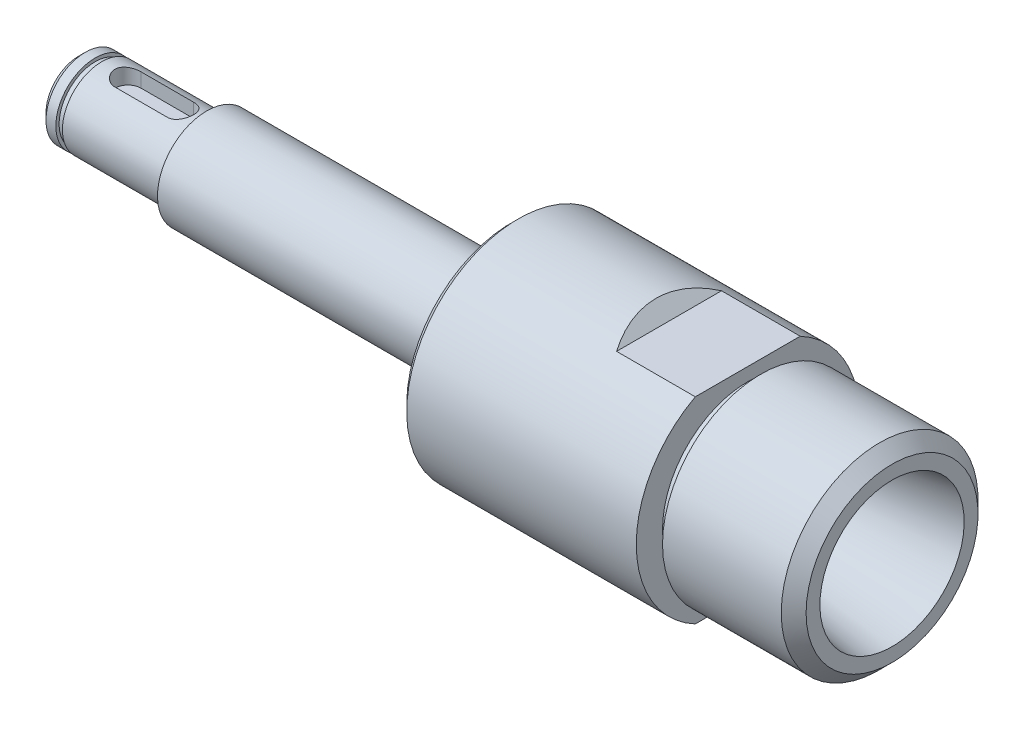
ISO-10303-21;
HEADER;
FILE_DESCRIPTION(('STEP AP214'),'2;1');
FILE_NAME('part.step','',(''),(''),'','','');
FILE_SCHEMA(('AUTOMOTIVE_DESIGN { 1 0 10303 214 1 1 1 1 }'));
ENDSEC;
DATA;
#1=APPLICATION_CONTEXT('core data for automotive mechanical design processes');
#2=APPLICATION_PROTOCOL_DEFINITION('international standard','automotive_design',2000,#1);
#3=PRODUCT_CONTEXT('',#1,'mechanical');
#4=PRODUCT('Part','Part','',(#3));
#5=PRODUCT_RELATED_PRODUCT_CATEGORY('part','',(#4));
#6=PRODUCT_DEFINITION_FORMATION('','',#4);
#7=PRODUCT_DEFINITION_CONTEXT('part definition',#1,'design');
#8=PRODUCT_DEFINITION('design','',#6,#7);
#9=PRODUCT_DEFINITION_SHAPE('','',#8);
#10=(LENGTH_UNIT() NAMED_UNIT(*) SI_UNIT(.MILLI.,.METRE.));
#11=(NAMED_UNIT(*) PLANE_ANGLE_UNIT() SI_UNIT($,.RADIAN.));
#12=(NAMED_UNIT(*) SI_UNIT($,.STERADIAN.) SOLID_ANGLE_UNIT());
#13=UNCERTAINTY_MEASURE_WITH_UNIT(LENGTH_MEASURE(1.E-05),#10,'distance_accuracy_value','');
#14=(GEOMETRIC_REPRESENTATION_CONTEXT(3) GLOBAL_UNCERTAINTY_ASSIGNED_CONTEXT((#13)) GLOBAL_UNIT_ASSIGNED_CONTEXT((#10,
#11,#12)) REPRESENTATION_CONTEXT('',''));
#15=CARTESIAN_POINT('',(0.,0.,0.));
#16=DIRECTION('',(0.,0.,1.));
#17=DIRECTION('',(1.,0.,0.));
#18=AXIS2_PLACEMENT_3D('',#15,#16,#17);
#19=CARTESIAN_POINT('',(124.,0.,0.));
#20=DIRECTION('',(1.,0.,0.));
#21=DIRECTION('',(0.,1.,0.));
#22=AXIS2_PLACEMENT_3D('',#19,#20,#21);
#23=CYLINDRICAL_SURFACE('',#22,5.99999999999998);
#24=CARTESIAN_POINT('',(3.5,0.,0.));
#25=DIRECTION('',(1.,0.,0.));
#26=DIRECTION('',(0.,1.,0.));
#27=AXIS2_PLACEMENT_3D('',#24,#25,#26);
#28=CIRCLE('',#27,5.99999999999998);
#29=CARTESIAN_POINT('',(3.5,5.99999999999998,0.));
#30=VERTEX_POINT('',#29);
#31=EDGE_CURVE('E222',#30,#30,#28,.T.);
#32=ORIENTED_EDGE('',*,*,#31,.T.);
#33=EDGE_LOOP('',(#32));
#34=FACE_BOUND('',#33,.T.);
#35=CARTESIAN_POINT('',(18.5,0.,0.));
#36=DIRECTION('',(1.,0.,0.));
#37=DIRECTION('',(0.,1.,0.));
#38=AXIS2_PLACEMENT_3D('',#35,#36,#37);
#39=CIRCLE('',#38,5.99999999999998);
#40=CARTESIAN_POINT('',(18.5,5.99999999999998,0.));
#41=VERTEX_POINT('',#40);
#42=EDGE_CURVE('E219',#41,#41,#39,.T.);
#43=ORIENTED_EDGE('',*,*,#42,.F.);
#44=EDGE_LOOP('',(#43));
#45=FACE_BOUND('',#44,.T.);
#46=DIRECTION('',(1.,0.,0.));
#47=VECTOR('',#46,1.);
#48=CARTESIAN_POINT('',(124.,5.65685424949236,-2.00000000000001));
#49=LINE('',#48,#47);
#50=CARTESIAN_POINT('',(7.5,5.65685424949236,-2.));
#51=VERTEX_POINT('',#50);
#52=CARTESIAN_POINT('',(15.5,5.65685424949236,-2.));
#53=VERTEX_POINT('',#52);
#54=EDGE_CURVE('E279',#51,#53,#49,.T.);
#55=ORIENTED_EDGE('',*,*,#54,.T.);
#56=CARTESIAN_POINT('',(15.5,5.65685424949236,-2.));
#57=CARTESIAN_POINT('',(15.5545809936022,5.65684884188676,-2.0000014949184));
#58=CARTESIAN_POINT('',(15.6091341243787,5.65764519886488,-1.99776424917478));
#59=CARTESIAN_POINT('',(15.7178171681098,5.6607865457844,-1.9888512140728));
#60=CARTESIAN_POINT('',(15.7719471913194,5.66313111768242,-1.98217662286705));
#61=CARTESIAN_POINT('',(15.9327842863903,5.672381844493,-1.95562135046158));
#62=CARTESIAN_POINT('',(16.038361692541,5.68150584999028,-1.92920846605623));
#63=CARTESIAN_POINT('',(16.2432503848876,5.70456149397716,-1.85991682366086));
#64=CARTESIAN_POINT('',(16.3425650937458,5.71849047905857,-1.81704715197507));
#65=CARTESIAN_POINT('',(16.5326796680109,5.74957574438919,-1.71614645792974));
#66=CARTESIAN_POINT('',(16.6234742581347,5.76673400456215,-1.65810612564547));
#67=CARTESIAN_POINT('',(16.7974404626491,5.80308960804093,-1.52610278704602));
#68=CARTESIAN_POINT('',(16.8802297609252,5.82233755536616,-1.45164996064407));
#69=CARTESIAN_POINT('',(17.0324120355834,5.86027697385954,-1.28997688598297));
#70=CARTESIAN_POINT('',(17.1018026265119,5.87896834543704,-1.20275436910907));
#71=CARTESIAN_POINT('',(17.2269590376084,5.91427765988453,-1.01520729191253));
#72=CARTESIAN_POINT('',(17.2823219688045,5.93082875123706,-0.914600178716994));
#73=CARTESIAN_POINT('',(17.3751845033745,5.95939217209315,-0.704858499931718));
#74=CARTESIAN_POINT('',(17.4126895636409,5.97140588786618,-0.59572655118684));
#75=CARTESIAN_POINT('',(17.4674714521827,5.98918142285844,-0.376058690956073));
#76=CARTESIAN_POINT('',(17.4854065451074,5.99514617977145,-0.265703668920224));
#77=CARTESIAN_POINT('',(17.5026325970512,6.00087216807632,-0.0433979389113463));
#78=CARTESIAN_POINT('',(17.5019279985395,6.00063487762603,0.0685523824907843));
#79=CARTESIAN_POINT('',(17.4823114337867,5.9941207727053,0.286207690558783));
#80=CARTESIAN_POINT('',(17.4641147240811,5.98808121982526,0.391985405251072));
#81=CARTESIAN_POINT('',(17.4112136026518,5.97093921001645,0.598888128753311));
#82=CARTESIAN_POINT('',(17.3765082755875,5.95983647235461,0.700012879232928));
#83=CARTESIAN_POINT('',(17.2911572607987,5.93351336542607,0.896305246061924));
#84=CARTESIAN_POINT('',(17.2403079097553,5.91824075676624,0.991377011307984));
#85=CARTESIAN_POINT('',(17.1242800972186,5.88516775360086,1.17184917819498));
#86=CARTESIAN_POINT('',(17.059097737907,5.86736667195185,1.25724693942937));
#87=CARTESIAN_POINT('',(16.9126579000063,5.83012543885477,1.42019467942242));
#88=CARTESIAN_POINT('',(16.8307889127806,5.81064757359827,1.4971872232254));
#89=CARTESIAN_POINT('',(16.6551170205677,5.77294980945701,1.63654404964077));
#90=CARTESIAN_POINT('',(16.5613102751935,5.75473031831505,1.69890360636763));
#91=CARTESIAN_POINT('',(16.3626396432934,5.72140062752633,1.80800665118557));
#92=CARTESIAN_POINT('',(16.2576329701341,5.70634029896467,1.85450601901537));
#93=CARTESIAN_POINT('',(16.0407060448201,5.68162194124076,1.92892046140223));
#94=CARTESIAN_POINT('',(15.9287970132557,5.67195538817984,1.95686487211071));
#95=CARTESIAN_POINT('',(15.763162726504,5.66273084189438,1.98331631256166));
#96=CARTESIAN_POINT('',(15.7107172202915,5.66053335389202,1.98957012251023));
#97=CARTESIAN_POINT('',(15.6055238432004,5.65759407142796,1.99790923214239));
#98=CARTESIAN_POINT('',(15.5527764509112,5.65685039859054,1.99999991078996));
#99=CARTESIAN_POINT('',(15.5,5.65685424949236,2.));
#100=B_SPLINE_CURVE_WITH_KNOTS('',3,(#56,#57,#58,#59,#60,#61,#62,#63,#64,#65,#66,#67,#68,#69,
#70,#71,#72,#73,#74,#75,#76,#77,#78,#79,#80,#81,#82,#83,#84,#85,#86,#87,#88,#89,#90,#91,#92,#93,
#94,#95,#96,#97,#98,#99),.UNSPECIFIED.,.F.,.F.,(4,2,2,2,2,2,2,2,2,2,2,2,2,2,2,2,2,2,2,2,2,4),
(0.,0.163636969470864,0.327229772338923,0.653162396790745,0.978915321932474,1.30486862627062,
1.64233009925355,1.97985159727495,2.32618265866202,2.67240782242255,3.00658941454806,
3.34069136061284,3.6616883693147,3.98270317816496,4.30794037651935,4.63326613177537,
4.973881081161,5.31460588498485,5.6603605985608,6.00556734973678,6.16399790665503,
6.32222363058113),.UNSPECIFIED.);
#101=CARTESIAN_POINT('',(15.5,5.65685424949237,2.));
#102=VERTEX_POINT('',#101);
#103=EDGE_CURVE('E304',#53,#102,#100,.T.);
#104=ORIENTED_EDGE('',*,*,#103,.T.);
#105=DIRECTION('',(1.,0.,0.));
#106=VECTOR('',#105,1.);
#107=CARTESIAN_POINT('',(124.,5.65685424949237,1.99999999999998));
#108=LINE('',#107,#106);
#109=CARTESIAN_POINT('',(7.50000000000001,5.65685424949237,1.99999999999998));
#110=VERTEX_POINT('',#109);
#111=EDGE_CURVE('E267',#102,#110,#108,.F.);
#112=ORIENTED_EDGE('',*,*,#111,.T.);
#113=CARTESIAN_POINT('',(7.5,5.65685424949236,2.));
#114=CARTESIAN_POINT('',(7.44541900639777,5.65684884188676,2.0000014949184));
#115=CARTESIAN_POINT('',(7.39086587562135,5.65764519886489,1.99776424917478));
#116=CARTESIAN_POINT('',(7.28218283189021,5.6607865457844,1.9888512140728));
#117=CARTESIAN_POINT('',(7.22805280868062,5.66313111768242,1.98217662286705));
#118=CARTESIAN_POINT('',(7.06721571360973,5.672381844493,1.95562135046158));
#119=CARTESIAN_POINT('',(6.96163830745905,5.68150584999028,1.92920846605623));
#120=CARTESIAN_POINT('',(6.75674961511245,5.70456149397716,1.85991682366086));
#121=CARTESIAN_POINT('',(6.65743490625416,5.71849047905857,1.81704715197507));
#122=CARTESIAN_POINT('',(6.46732033198908,5.74957574438919,1.71614645792974));
#123=CARTESIAN_POINT('',(6.37652574186531,5.76673400456215,1.65810612564547));
#124=CARTESIAN_POINT('',(6.20255953735094,5.80308960804093,1.52610278704603));
#125=CARTESIAN_POINT('',(6.11977023907478,5.82233755536616,1.45164996064407));
#126=CARTESIAN_POINT('',(5.96758796441661,5.86027697385954,1.28997688598296));
#127=CARTESIAN_POINT('',(5.89819737348812,5.87896834543704,1.20275436910907));
#128=CARTESIAN_POINT('',(5.77304096239161,5.91427765988453,1.01520729191253));
#129=CARTESIAN_POINT('',(5.71767803119549,5.93082875123706,0.914600178716992));
#130=CARTESIAN_POINT('',(5.62481549662547,5.95939217209315,0.704858499931717));
#131=CARTESIAN_POINT('',(5.58731043635913,5.97140588786617,0.595726551186839));
#132=CARTESIAN_POINT('',(5.53252854781726,5.98918142285844,0.376058690956073));
#133=CARTESIAN_POINT('',(5.51459345489264,5.99514617977145,0.265703668920223));
#134=CARTESIAN_POINT('',(5.49736740294879,6.00087216807632,0.043397938911345));
#135=CARTESIAN_POINT('',(5.49807200146051,6.00063487762603,-0.068552382490786));
#136=CARTESIAN_POINT('',(5.51768856621331,5.9941207727053,-0.286207690558786));
#137=CARTESIAN_POINT('',(5.53588527591893,5.98808121982526,-0.391985405251074));
#138=CARTESIAN_POINT('',(5.58878639734825,5.97093921001646,-0.598888128753314));
#139=CARTESIAN_POINT('',(5.62349172441251,5.95983647235461,-0.70001287923293));
#140=CARTESIAN_POINT('',(5.70884273920127,5.93351336542607,-0.896305246061926));
#141=CARTESIAN_POINT('',(5.75969209024468,5.91824075676623,-0.991377011307985));
#142=CARTESIAN_POINT('',(5.8757199027814,5.88516775360086,-1.17184917819498));
#143=CARTESIAN_POINT('',(5.94090226209303,5.86736667195185,-1.25724693942937));
#144=CARTESIAN_POINT('',(6.08734209999369,5.83012543885477,-1.42019467942243));
#145=CARTESIAN_POINT('',(6.16921108721942,5.81064757359827,-1.4971872232254));
#146=CARTESIAN_POINT('',(6.34488297943233,5.77294980945701,-1.63654404964077));
#147=CARTESIAN_POINT('',(6.43868972480649,5.75473031831505,-1.69890360636763));
#148=CARTESIAN_POINT('',(6.63736035670657,5.72140062752633,-1.80800665118557));
#149=CARTESIAN_POINT('',(6.74236702986589,5.70634029896467,-1.85450601901537));
#150=CARTESIAN_POINT('',(6.95929395517991,5.68162194124076,-1.92892046140223));
#151=CARTESIAN_POINT('',(7.07120298674431,5.67195538817984,-1.95686487211071));
#152=CARTESIAN_POINT('',(7.23683727349597,5.66273084189438,-1.98331631256166));
#153=CARTESIAN_POINT('',(7.28928277970846,5.66053335389202,-1.98957012251023));
#154=CARTESIAN_POINT('',(7.39447615679963,5.65759407142796,-1.9979092321424));
#155=CARTESIAN_POINT('',(7.44722354908881,5.65685039859054,-1.99999991078996));
#156=CARTESIAN_POINT('',(7.50000000000001,5.65685424949236,-2.));
#157=B_SPLINE_CURVE_WITH_KNOTS('',3,(#113,#114,#115,#116,#117,#118,#119,#120,#121,#122,#123,
#124,#125,#126,#127,#128,#129,#130,#131,#132,#133,#134,#135,#136,#137,#138,#139,#140,#141,#142,
#143,#144,#145,#146,#147,#148,#149,#150,#151,#152,#153,#154,#155,#156),.UNSPECIFIED.,.F.,.F.,(4,
2,2,2,2,2,2,2,2,2,2,2,2,2,2,2,2,2,2,2,2,4),(0.,0.163636969470865,0.327229772338923,
0.653162396790746,0.978915321932474,1.30486862627062,1.64233009925355,1.97985159727495,
2.32618265866203,2.67240782242255,3.00658941454806,3.34069136061285,3.6616883693147,
3.98270317816496,4.30794037651936,4.63326613177537,4.97388108116101,5.31460588498485,
5.6603605985608,6.00556734973678,6.16399790665503,6.32222363058113),.UNSPECIFIED.);
#158=EDGE_CURVE('E270',#110,#51,#157,.T.);
#159=ORIENTED_EDGE('',*,*,#158,.T.);
#160=EDGE_LOOP('',(#55,#104,#112,#159));
#161=FACE_BOUND('',#160,.T.);
#162=ADVANCED_FACE('F47',(#34,#45,#161),#23,.T.);
#163=CARTESIAN_POINT('',(124.,0.,0.));
#164=DIRECTION('',(1.,0.,0.));
#165=DIRECTION('',(0.,1.,0.));
#166=AXIS2_PLACEMENT_3D('',#163,#164,#165);
#167=CYLINDRICAL_SURFACE('',#166,17.);
#168=CARTESIAN_POINT('',(67.,0.,0.));
#169=DIRECTION('',(-1.,0.,0.));
#170=DIRECTION('',(0.,-1.,0.));
#171=AXIS2_PLACEMENT_3D('',#168,#169,#170);
#172=CIRCLE('',#171,17.);
#173=CARTESIAN_POINT('',(67.,-17.,0.));
#174=VERTEX_POINT('',#173);
#175=EDGE_CURVE('E234',#174,#174,#172,.F.);
#176=ORIENTED_EDGE('',*,*,#175,.T.);
#177=EDGE_LOOP('',(#176));
#178=FACE_BOUND('',#177,.T.);
#179=CARTESIAN_POINT('',(102.,0.,0.));
#180=DIRECTION('',(1.,0.,0.));
#181=DIRECTION('',(0.,1.,0.));
#182=AXIS2_PLACEMENT_3D('',#179,#180,#181);
#183=CIRCLE('',#182,17.);
#184=CARTESIAN_POINT('',(102.,15.,-7.99999999999999));
#185=VERTEX_POINT('',#184);
#186=CARTESIAN_POINT('',(102.,-15.,-7.99999999999998));
#187=VERTEX_POINT('',#186);
#188=EDGE_CURVE('E204',#185,#187,#183,.F.);
#189=ORIENTED_EDGE('',*,*,#188,.T.);
#190=DIRECTION('',(1.,0.,0.));
#191=VECTOR('',#190,1.);
#192=CARTESIAN_POINT('',(124.,-15.,-7.99999999999998));
#193=LINE('',#192,#191);
#194=CARTESIAN_POINT('',(90.,-15.,-7.99999999999998));
#195=VERTEX_POINT('',#194);
#196=EDGE_CURVE('E181',#187,#195,#193,.F.);
#197=ORIENTED_EDGE('',*,*,#196,.T.);
#198=CARTESIAN_POINT('',(105.,0.,0.));
#199=DIRECTION('',(0.70710678118654,-0.707106781186555,0.));
#200=DIRECTION('',(0.707106781186555,0.70710678118654,0.));
#201=AXIS2_PLACEMENT_3D('',#198,#199,#200);
#202=ELLIPSE('',#201,24.0416305603429,17.);
#203=CARTESIAN_POINT('',(88.,-17.,0.));
#204=VERTEX_POINT('',#203);
#205=EDGE_CURVE('E260',#195,#204,#202,.F.);
#206=ORIENTED_EDGE('',*,*,#205,.T.);
#207=CARTESIAN_POINT('',(105.,0.,0.));
#208=DIRECTION('',(0.70710678118654,-0.707106781186555,0.));
#209=DIRECTION('',(0.707106781186555,0.70710678118654,0.));
#210=AXIS2_PLACEMENT_3D('',#207,#208,#209);
#211=ELLIPSE('',#210,24.0416305603429,17.);
#212=CARTESIAN_POINT('',(90.,-15.,7.99999999999998));
#213=VERTEX_POINT('',#212);
#214=EDGE_CURVE('E262',#204,#213,#211,.F.);
#215=ORIENTED_EDGE('',*,*,#214,.T.);
#216=DIRECTION('',(1.,0.,0.));
#217=VECTOR('',#216,1.);
#218=CARTESIAN_POINT('',(124.,-15.,7.99999999999998));
#219=LINE('',#218,#217);
#220=CARTESIAN_POINT('',(102.,-15.,7.99999999999998));
#221=VERTEX_POINT('',#220);
#222=EDGE_CURVE('E179',#213,#221,#219,.T.);
#223=ORIENTED_EDGE('',*,*,#222,.T.);
#224=CARTESIAN_POINT('',(102.,15.,7.99999999999999));
#225=VERTEX_POINT('',#224);
#226=EDGE_CURVE('E197',#221,#225,#183,.F.);
#227=ORIENTED_EDGE('',*,*,#226,.T.);
#228=DIRECTION('',(1.,0.,0.));
#229=VECTOR('',#228,1.);
#230=CARTESIAN_POINT('',(124.,15.,7.99999999999999));
#231=LINE('',#230,#229);
#232=CARTESIAN_POINT('',(90.,15.,7.99999999999999));
#233=VERTEX_POINT('',#232);
#234=EDGE_CURVE('E177',#225,#233,#231,.F.);
#235=ORIENTED_EDGE('',*,*,#234,.T.);
#236=CARTESIAN_POINT('',(105.,0.,0.));
#237=DIRECTION('',(0.707106781186542,0.707106781186553,0.));
#238=DIRECTION('',(0.707106781186553,-0.707106781186542,0.));
#239=AXIS2_PLACEMENT_3D('',#236,#237,#238);
#240=ELLIPSE('',#239,24.0416305603428,17.);
#241=CARTESIAN_POINT('',(88.,17.,0.));
#242=VERTEX_POINT('',#241);
#243=EDGE_CURVE('E71',#233,#242,#240,.F.);
#244=ORIENTED_EDGE('',*,*,#243,.T.);
#245=CARTESIAN_POINT('',(105.,0.,0.));
#246=DIRECTION('',(0.707106781186542,0.707106781186553,0.));
#247=DIRECTION('',(0.707106781186553,-0.707106781186542,0.));
#248=AXIS2_PLACEMENT_3D('',#245,#246,#247);
#249=ELLIPSE('',#248,24.0416305603428,17.);
#250=CARTESIAN_POINT('',(90.,15.,-7.99999999999999));
#251=VERTEX_POINT('',#250);
#252=EDGE_CURVE('E265',#242,#251,#249,.F.);
#253=ORIENTED_EDGE('',*,*,#252,.T.);
#254=DIRECTION('',(1.,0.,0.));
#255=VECTOR('',#254,1.);
#256=CARTESIAN_POINT('',(124.,15.,-7.99999999999999));
#257=LINE('',#256,#255);
#258=EDGE_CURVE('E175',#251,#185,#257,.T.);
#259=ORIENTED_EDGE('',*,*,#258,.T.);
#260=EDGE_LOOP('',(#189,#197,#206,#215,#223,#227,#235,#244,#253,#259));
#261=FACE_BOUND('',#260,.T.);
#262=ADVANCED_FACE('F322',(#178,#261),#167,.T.);
#263=CARTESIAN_POINT('',(102.,0.,0.));
#264=DIRECTION('',(1.,0.,0.));
#265=DIRECTION('',(0.,1.,0.));
#266=AXIS2_PLACEMENT_3D('',#263,#264,#265);
#267=PLANE('',#266);
#268=CARTESIAN_POINT('',(102.,0.,0.));
#269=DIRECTION('',(1.,0.,0.));
#270=DIRECTION('',(0.,1.,0.));
#271=AXIS2_PLACEMENT_3D('',#268,#269,#270);
#272=CIRCLE('',#271,13.);
#273=CARTESIAN_POINT('',(102.,13.,0.));
#274=VERTEX_POINT('',#273);
#275=EDGE_CURVE('E193',#274,#274,#272,.T.);
#276=ORIENTED_EDGE('',*,*,#275,.F.);
#277=EDGE_LOOP('',(#276));
#278=FACE_BOUND('',#277,.T.);
#279=ORIENTED_EDGE('',*,*,#226,.F.);
#280=DIRECTION('',(0.,0.,-1.));
#281=VECTOR('',#280,1.);
#282=CARTESIAN_POINT('',(102.,-15.,0.));
#283=LINE('',#282,#281);
#284=EDGE_CURVE('E251',#221,#187,#283,.T.);
#285=ORIENTED_EDGE('',*,*,#284,.T.);
#286=ORIENTED_EDGE('',*,*,#188,.F.);
#287=DIRECTION('',(0.,0.,1.));
#288=VECTOR('',#287,1.);
#289=CARTESIAN_POINT('',(102.,15.,0.));
#290=LINE('',#289,#288);
#291=EDGE_CURVE('E246',#185,#225,#290,.T.);
#292=ORIENTED_EDGE('',*,*,#291,.T.);
#293=EDGE_LOOP('',(#279,#285,#286,#292));
#294=FACE_BOUND('',#293,.T.);
#295=ADVANCED_FACE('F328',(#278,#294),#267,.T.);
#296=CARTESIAN_POINT('',(0.,0.,0.));
#297=DIRECTION('',(-1.,0.,0.));
#298=DIRECTION('',(0.,-1.,0.));
#299=AXIS2_PLACEMENT_3D('',#296,#297,#298);
#300=PLANE('',#299);
#301=CARTESIAN_POINT('',(0.,0.,0.));
#302=DIRECTION('',(-1.,0.,0.));
#303=DIRECTION('',(0.,-1.,0.));
#304=AXIS2_PLACEMENT_3D('',#301,#302,#303);
#305=CIRCLE('',#304,5.);
#306=CARTESIAN_POINT('',(0.,-5.,0.));
#307=VERTEX_POINT('',#306);
#308=EDGE_CURVE('E243',#307,#307,#305,.T.);
#309=ORIENTED_EDGE('',*,*,#308,.T.);
#310=EDGE_LOOP('',(#309));
#311=FACE_BOUND('',#310,.T.);
#312=ADVANCED_FACE('F417',(#311),#300,.T.);
#313=CARTESIAN_POINT('',(124.,0.,0.));
#314=DIRECTION('',(1.,0.,0.));
#315=DIRECTION('',(0.,1.,0.));
#316=AXIS2_PLACEMENT_3D('',#313,#314,#315);
#317=CYLINDRICAL_SURFACE('',#316,5.99999999999998);
#318=CARTESIAN_POINT('',(0.999999999999987,0.,0.));
#319=DIRECTION('',(-1.,0.,0.));
#320=DIRECTION('',(0.,-1.,0.));
#321=AXIS2_PLACEMENT_3D('',#318,#319,#320);
#322=CIRCLE('',#321,5.99999999999998);
#323=CARTESIAN_POINT('',(0.999999999999987,-5.99999999999998,0.));
#324=VERTEX_POINT('',#323);
#325=EDGE_CURVE('E240',#324,#324,#322,.F.);
#326=ORIENTED_EDGE('',*,*,#325,.T.);
#327=EDGE_LOOP('',(#326));
#328=FACE_BOUND('',#327,.T.);
#329=CARTESIAN_POINT('',(2.5,0.,0.));
#330=DIRECTION('',(1.,0.,0.));
#331=DIRECTION('',(0.,1.,0.));
#332=AXIS2_PLACEMENT_3D('',#329,#330,#331);
#333=CIRCLE('',#332,5.99999999999998);
#334=CARTESIAN_POINT('',(2.5,5.99999999999998,0.));
#335=VERTEX_POINT('',#334);
#336=EDGE_CURVE('E231',#335,#335,#333,.T.);
#337=ORIENTED_EDGE('',*,*,#336,.F.);
#338=EDGE_LOOP('',(#337));
#339=FACE_BOUND('',#338,.T.);
#340=ADVANCED_FACE('F476',(#328,#339),#317,.T.);
#341=CARTESIAN_POINT('',(2.50000000000001,5.99999999999998,0.));
#342=DIRECTION('',(1.,0.,0.));
#343=DIRECTION('',(0.,1.,0.));
#344=AXIS2_PLACEMENT_3D('',#341,#342,#343);
#345=PLANE('',#344);
#346=ORIENTED_EDGE('',*,*,#336,.T.);
#347=EDGE_LOOP('',(#346));
#348=FACE_BOUND('',#347,.T.);
#349=CARTESIAN_POINT('',(2.5,0.,0.));
#350=DIRECTION('',(1.,0.,0.));
#351=DIRECTION('',(0.,1.,0.));
#352=AXIS2_PLACEMENT_3D('',#349,#350,#351);
#353=CIRCLE('',#352,5.49999999999998);
#354=CARTESIAN_POINT('',(2.5,5.49999999999998,0.));
#355=VERTEX_POINT('',#354);
#356=EDGE_CURVE('E228',#355,#355,#353,.T.);
#357=ORIENTED_EDGE('',*,*,#356,.F.);
#358=EDGE_LOOP('',(#357));
#359=FACE_BOUND('',#358,.T.);
#360=ADVANCED_FACE('F469',(#348,#359),#345,.T.);
#361=CARTESIAN_POINT('',(124.,0.,0.));
#362=DIRECTION('',(1.,0.,0.));
#363=DIRECTION('',(0.,1.,0.));
#364=AXIS2_PLACEMENT_3D('',#361,#362,#363);
#365=CYLINDRICAL_SURFACE('',#364,5.49999999999998);
#366=ORIENTED_EDGE('',*,*,#356,.T.);
#367=EDGE_LOOP('',(#366));
#368=FACE_BOUND('',#367,.T.);
#369=CARTESIAN_POINT('',(3.5,0.,0.));
#370=DIRECTION('',(1.,0.,0.));
#371=DIRECTION('',(0.,1.,0.));
#372=AXIS2_PLACEMENT_3D('',#369,#370,#371);
#373=CIRCLE('',#372,5.49999999999998);
#374=CARTESIAN_POINT('',(3.5,5.49999999999998,0.));
#375=VERTEX_POINT('',#374);
#376=EDGE_CURVE('E225',#375,#375,#373,.T.);
#377=ORIENTED_EDGE('',*,*,#376,.F.);
#378=EDGE_LOOP('',(#377));
#379=FACE_BOUND('',#378,.T.);
#380=ADVANCED_FACE('F451',(#368,#379),#365,.T.);
#381=CARTESIAN_POINT('',(3.50000000000001,5.49999999999998,0.));
#382=DIRECTION('',(-1.,0.,0.));
#383=DIRECTION('',(0.,-1.,0.));
#384=AXIS2_PLACEMENT_3D('',#381,#382,#383);
#385=PLANE('',#384);
#386=ORIENTED_EDGE('',*,*,#376,.T.);
#387=EDGE_LOOP('',(#386));
#388=FACE_BOUND('',#387,.T.);
#389=ORIENTED_EDGE('',*,*,#31,.F.);
#390=EDGE_LOOP('',(#389));
#391=FACE_BOUND('',#390,.T.);
#392=ADVANCED_FACE('F446',(#388,#391),#385,.T.);
#393=CARTESIAN_POINT('',(18.5,5.99999999999998,0.));
#394=DIRECTION('',(1.,0.,0.));
#395=DIRECTION('',(0.,1.,0.));
#396=AXIS2_PLACEMENT_3D('',#393,#394,#395);
#397=PLANE('',#396);
#398=ORIENTED_EDGE('',*,*,#42,.T.);
#399=EDGE_LOOP('',(#398));
#400=FACE_BOUND('',#399,.T.);
#401=CARTESIAN_POINT('',(18.5,0.,0.));
#402=DIRECTION('',(1.,0.,0.));
#403=DIRECTION('',(0.,1.,0.));
#404=AXIS2_PLACEMENT_3D('',#401,#402,#403);
#405=CIRCLE('',#404,5.49999999999998);
#406=CARTESIAN_POINT('',(18.5,5.49999999999998,0.));
#407=VERTEX_POINT('',#406);
#408=EDGE_CURVE('E216',#407,#407,#405,.T.);
#409=ORIENTED_EDGE('',*,*,#408,.F.);
#410=EDGE_LOOP('',(#409));
#411=FACE_BOUND('',#410,.T.);
#412=ADVANCED_FACE('F443',(#400,#411),#397,.T.);
#413=CARTESIAN_POINT('',(124.,0.,0.));
#414=DIRECTION('',(1.,0.,0.));
#415=DIRECTION('',(0.,1.,0.));
#416=AXIS2_PLACEMENT_3D('',#413,#414,#415);
#417=CYLINDRICAL_SURFACE('',#416,5.49999999999998);
#418=ORIENTED_EDGE('',*,*,#408,.T.);
#419=EDGE_LOOP('',(#418));
#420=FACE_BOUND('',#419,.T.);
#421=CARTESIAN_POINT('',(19.5,0.,0.));
#422=DIRECTION('',(1.,0.,0.));
#423=DIRECTION('',(0.,1.,0.));
#424=AXIS2_PLACEMENT_3D('',#421,#422,#423);
#425=CIRCLE('',#424,5.49999999999998);
#426=CARTESIAN_POINT('',(19.5,5.49999999999998,0.));
#427=VERTEX_POINT('',#426);
#428=EDGE_CURVE('E213',#427,#427,#425,.T.);
#429=ORIENTED_EDGE('',*,*,#428,.F.);
#430=EDGE_LOOP('',(#429));
#431=FACE_BOUND('',#430,.T.);
#432=ADVANCED_FACE('F440',(#420,#431),#417,.T.);
#433=CARTESIAN_POINT('',(19.5,5.49999999999998,0.));
#434=DIRECTION('',(-1.,0.,0.));
#435=DIRECTION('',(0.,-1.,0.));
#436=AXIS2_PLACEMENT_3D('',#433,#434,#435);
#437=PLANE('',#436);
#438=ORIENTED_EDGE('',*,*,#428,.T.);
#439=EDGE_LOOP('',(#438));
#440=FACE_BOUND('',#439,.T.);
#441=CARTESIAN_POINT('',(19.5,0.,0.));
#442=DIRECTION('',(1.,0.,0.));
#443=DIRECTION('',(0.,1.,0.));
#444=AXIS2_PLACEMENT_3D('',#441,#442,#443);
#445=CIRCLE('',#444,7.49999999999999);
#446=CARTESIAN_POINT('',(19.5,7.49999999999999,0.));
#447=VERTEX_POINT('',#446);
#448=EDGE_CURVE('E210',#447,#447,#445,.T.);
#449=ORIENTED_EDGE('',*,*,#448,.F.);
#450=EDGE_LOOP('',(#449));
#451=FACE_BOUND('',#450,.T.);
#452=ADVANCED_FACE('F436',(#440,#451),#437,.T.);
#453=CARTESIAN_POINT('',(124.,0.,0.));
#454=DIRECTION('',(1.,0.,0.));
#455=DIRECTION('',(0.,1.,0.));
#456=AXIS2_PLACEMENT_3D('',#453,#454,#455);
#457=CYLINDRICAL_SURFACE('',#456,7.5);
#458=ORIENTED_EDGE('',*,*,#448,.T.);
#459=EDGE_LOOP('',(#458));
#460=FACE_BOUND('',#459,.T.);
#461=CARTESIAN_POINT('',(64.,0.,0.));
#462=DIRECTION('',(1.,0.,0.));
#463=DIRECTION('',(0.,1.,0.));
#464=AXIS2_PLACEMENT_3D('',#461,#462,#463);
#465=CIRCLE('',#464,7.50000000000002);
#466=CARTESIAN_POINT('',(64.,7.50000000000002,0.));
#467=VERTEX_POINT('',#466);
#468=EDGE_CURVE('E207',#467,#467,#465,.T.);
#469=ORIENTED_EDGE('',*,*,#468,.F.);
#470=EDGE_LOOP('',(#469));
#471=FACE_BOUND('',#470,.T.);
#472=ADVANCED_FACE('F432',(#460,#471),#457,.T.);
#473=CARTESIAN_POINT('',(64.,7.50000000000002,0.));
#474=DIRECTION('',(1.,0.,0.));
#475=DIRECTION('',(0.,1.,0.));
#476=AXIS2_PLACEMENT_3D('',#473,#474,#475);
#477=PLANE('',#476);
#478=ORIENTED_EDGE('',*,*,#468,.T.);
#479=EDGE_LOOP('',(#478));
#480=FACE_BOUND('',#479,.T.);
#481=CARTESIAN_POINT('',(64.,0.,0.));
#482=DIRECTION('',(1.,0.,0.));
#483=DIRECTION('',(0.,1.,0.));
#484=AXIS2_PLACEMENT_3D('',#481,#482,#483);
#485=CIRCLE('',#484,6.49999999999999);
#486=CARTESIAN_POINT('',(64.,6.49999999999999,0.));
#487=VERTEX_POINT('',#486);
#488=EDGE_CURVE('E203',#487,#487,#485,.T.);
#489=ORIENTED_EDGE('',*,*,#488,.F.);
#490=EDGE_LOOP('',(#489));
#491=FACE_BOUND('',#490,.T.);
#492=ADVANCED_FACE('F428',(#480,#491),#477,.T.);
#493=CARTESIAN_POINT('',(124.,0.,0.));
#494=DIRECTION('',(1.,0.,0.));
#495=DIRECTION('',(0.,1.,0.));
#496=AXIS2_PLACEMENT_3D('',#493,#494,#495);
#497=CYLINDRICAL_SURFACE('',#496,6.49999999999999);
#498=ORIENTED_EDGE('',*,*,#488,.T.);
#499=EDGE_LOOP('',(#498));
#500=FACE_BOUND('',#499,.T.);
#501=CARTESIAN_POINT('',(66.,0.,0.));
#502=DIRECTION('',(1.,0.,0.));
#503=DIRECTION('',(0.,1.,0.));
#504=AXIS2_PLACEMENT_3D('',#501,#502,#503);
#505=CIRCLE('',#504,6.49999999999999);
#506=CARTESIAN_POINT('',(66.,6.49999999999999,0.));
#507=VERTEX_POINT('',#506);
#508=EDGE_CURVE('E200',#507,#507,#505,.T.);
#509=ORIENTED_EDGE('',*,*,#508,.F.);
#510=EDGE_LOOP('',(#509));
#511=FACE_BOUND('',#510,.T.);
#512=ADVANCED_FACE('F424',(#500,#511),#497,.T.);
#513=CARTESIAN_POINT('',(66.,6.49999999999999,0.));
#514=DIRECTION('',(-1.,0.,0.));
#515=DIRECTION('',(0.,-1.,0.));
#516=AXIS2_PLACEMENT_3D('',#513,#514,#515);
#517=PLANE('',#516);
#518=CARTESIAN_POINT('',(66.,0.,0.));
#519=DIRECTION('',(-1.,0.,0.));
#520=DIRECTION('',(0.,-1.,0.));
#521=AXIS2_PLACEMENT_3D('',#518,#519,#520);
#522=CIRCLE('',#521,16.);
#523=CARTESIAN_POINT('',(66.,-16.,0.));
#524=VERTEX_POINT('',#523);
#525=EDGE_CURVE('E237',#524,#524,#522,.T.);
#526=ORIENTED_EDGE('',*,*,#525,.T.);
#527=EDGE_LOOP('',(#526));
#528=FACE_BOUND('',#527,.T.);
#529=ORIENTED_EDGE('',*,*,#508,.T.);
#530=EDGE_LOOP('',(#529));
#531=FACE_BOUND('',#530,.T.);
#532=ADVANCED_FACE('F420',(#528,#531),#517,.T.);
#533=CARTESIAN_POINT('',(67.,0.,0.));
#534=DIRECTION('',(1.,0.,0.));
#535=DIRECTION('',(0.,1.,0.));
#536=AXIS2_PLACEMENT_3D('',#533,#534,#535);
#537=CONICAL_SURFACE('',#536,17.,0.785398163397445);
#538=ORIENTED_EDGE('',*,*,#525,.F.);
#539=EDGE_LOOP('',(#538));
#540=FACE_BOUND('',#539,.T.);
#541=ORIENTED_EDGE('',*,*,#175,.F.);
#542=EDGE_LOOP('',(#541));
#543=FACE_BOUND('',#542,.T.);
#544=ADVANCED_FACE('F423',(#540,#543),#537,.T.);
#545=CARTESIAN_POINT('',(0.999999999999987,0.,0.));
#546=DIRECTION('',(1.,0.,0.));
#547=DIRECTION('',(0.,1.,0.));
#548=AXIS2_PLACEMENT_3D('',#545,#546,#547);
#549=CONICAL_SURFACE('',#548,5.99999999999998,0.785398163397445);
#550=ORIENTED_EDGE('',*,*,#308,.F.);
#551=EDGE_LOOP('',(#550));
#552=FACE_BOUND('',#551,.T.);
#553=ORIENTED_EDGE('',*,*,#325,.F.);
#554=EDGE_LOOP('',(#553));
#555=FACE_BOUND('',#554,.T.);
#556=ADVANCED_FACE('F414',(#552,#555),#549,.T.);
#557=CARTESIAN_POINT('',(104.,0.,0.));
#558=DIRECTION('',(1.,0.,0.));
#559=DIRECTION('',(0.,1.,0.));
#560=AXIS2_PLACEMENT_3D('',#557,#558,#559);
#561=PLANE('',#560);
#562=CARTESIAN_POINT('',(104.,0.,0.));
#563=DIRECTION('',(-1.,0.,0.));
#564=DIRECTION('',(0.,0.,1.));
#565=AXIS2_PLACEMENT_3D('',#562,#563,#564);
#566=CIRCLE('',#565,15.);
#567=CARTESIAN_POINT('',(104.,0.,15.));
#568=VERTEX_POINT('',#567);
#569=EDGE_CURVE('E190',#568,#568,#566,.T.);
#570=ORIENTED_EDGE('',*,*,#569,.T.);
#571=EDGE_LOOP('',(#570));
#572=FACE_BOUND('',#571,.T.);
#573=CARTESIAN_POINT('',(104.,0.,0.));
#574=DIRECTION('',(1.,0.,0.));
#575=DIRECTION('',(0.,1.,0.));
#576=AXIS2_PLACEMENT_3D('',#573,#574,#575);
#577=CIRCLE('',#576,13.);
#578=CARTESIAN_POINT('',(104.,13.,0.));
#579=VERTEX_POINT('',#578);
#580=EDGE_CURVE('E194',#579,#579,#577,.T.);
#581=ORIENTED_EDGE('',*,*,#580,.T.);
#582=EDGE_LOOP('',(#581));
#583=FACE_BOUND('',#582,.T.);
#584=ADVANCED_FACE('F410',(#572,#583),#561,.F.);
#585=CARTESIAN_POINT('',(104.,0.,0.));
#586=DIRECTION('',(-1.,0.,0.));
#587=DIRECTION('',(0.,-1.,0.));
#588=AXIS2_PLACEMENT_3D('',#585,#586,#587);
#589=CYLINDRICAL_SURFACE('',#588,13.);
#590=ORIENTED_EDGE('',*,*,#580,.F.);
#591=EDGE_LOOP('',(#590));
#592=FACE_BOUND('',#591,.T.);
#593=ORIENTED_EDGE('',*,*,#275,.T.);
#594=EDGE_LOOP('',(#593));
#595=FACE_BOUND('',#594,.T.);
#596=ADVANCED_FACE('F403',(#592,#595),#589,.T.);
#597=CARTESIAN_POINT('',(124.,0.,0.));
#598=DIRECTION('',(-1.,0.,0.));
#599=DIRECTION('',(0.,0.,1.));
#600=AXIS2_PLACEMENT_3D('',#597,#598,#599);
#601=CYLINDRICAL_SURFACE('',#600,15.);
#602=ORIENTED_EDGE('',*,*,#569,.F.);
#603=EDGE_LOOP('',(#602));
#604=FACE_BOUND('',#603,.T.);
#605=CARTESIAN_POINT('',(122.1055,0.,0.));
#606=DIRECTION('',(-1.,0.,0.));
#607=DIRECTION('',(0.,0.,1.));
#608=AXIS2_PLACEMENT_3D('',#605,#606,#607);
#609=CIRCLE('',#608,15.);
#610=CARTESIAN_POINT('',(122.1055,0.,15.));
#611=VERTEX_POINT('',#610);
#612=EDGE_CURVE('E184',#611,#611,#609,.T.);
#613=ORIENTED_EDGE('',*,*,#612,.T.);
#614=EDGE_LOOP('',(#613));
#615=FACE_BOUND('',#614,.T.);
#616=ADVANCED_FACE('F396',(#604,#615),#601,.T.);
#617=CARTESIAN_POINT('',(124.,0.,0.));
#618=DIRECTION('',(-1.,0.,0.));
#619=DIRECTION('',(0.,0.,1.));
#620=AXIS2_PLACEMENT_3D('',#617,#618,#619);
#621=CONICAL_SURFACE('',#620,13.1055,0.78539816339745);
#622=ORIENTED_EDGE('',*,*,#612,.F.);
#623=EDGE_LOOP('',(#622));
#624=FACE_BOUND('',#623,.T.);
#625=CARTESIAN_POINT('',(124.,0.,0.));
#626=DIRECTION('',(-1.,0.,0.));
#627=DIRECTION('',(0.,0.,1.));
#628=AXIS2_PLACEMENT_3D('',#625,#626,#627);
#629=CIRCLE('',#628,13.1055);
#630=CARTESIAN_POINT('',(124.,0.,13.1055));
#631=VERTEX_POINT('',#630);
#632=EDGE_CURVE('E187',#631,#631,#629,.T.);
#633=ORIENTED_EDGE('',*,*,#632,.T.);
#634=EDGE_LOOP('',(#633));
#635=FACE_BOUND('',#634,.T.);
#636=ADVANCED_FACE('F391',(#624,#635),#621,.T.);
#637=CARTESIAN_POINT('',(124.,17.,0.));
#638=DIRECTION('',(1.,0.,0.));
#639=DIRECTION('',(0.,1.,0.));
#640=AXIS2_PLACEMENT_3D('',#637,#638,#639);
#641=PLANE('',#640);
#642=CARTESIAN_POINT('',(124.,0.,0.));
#643=DIRECTION('',(1.,0.,0.));
#644=DIRECTION('',(0.,1.,0.));
#645=AXIS2_PLACEMENT_3D('',#642,#643,#644);
#646=CIRCLE('',#645,11.);
#647=CARTESIAN_POINT('',(124.,11.,0.));
#648=VERTEX_POINT('',#647);
#649=EDGE_CURVE('E130',#648,#648,#646,.T.);
#650=ORIENTED_EDGE('',*,*,#649,.F.);
#651=EDGE_LOOP('',(#650));
#652=FACE_BOUND('',#651,.T.);
#653=ORIENTED_EDGE('',*,*,#632,.F.);
#654=EDGE_LOOP('',(#653));
#655=FACE_BOUND('',#654,.T.);
#656=ADVANCED_FACE('F388',(#652,#655),#641,.T.);
#657=CARTESIAN_POINT('',(88.,15.,50.));
#658=DIRECTION('',(0.,1.,0.));
#659=DIRECTION('',(0.,0.,1.));
#660=AXIS2_PLACEMENT_3D('',#657,#658,#659);
#661=PLANE('',#660);
#662=ORIENTED_EDGE('',*,*,#258,.F.);
#663=DIRECTION('',(0.,0.,1.));
#664=VECTOR('',#663,1.);
#665=CARTESIAN_POINT('',(90.,15.,7.99999999999999));
#666=LINE('',#665,#664);
#667=EDGE_CURVE('E257',#251,#233,#666,.T.);
#668=ORIENTED_EDGE('',*,*,#667,.T.);
#669=ORIENTED_EDGE('',*,*,#234,.F.);
#670=ORIENTED_EDGE('',*,*,#291,.F.);
#671=EDGE_LOOP('',(#662,#668,#669,#670));
#672=FACE_BOUND('',#671,.T.);
#673=ADVANCED_FACE('F390',(#672),#661,.T.);
#674=CARTESIAN_POINT('',(88.,-15.,50.));
#675=DIRECTION('',(0.,-1.,0.));
#676=DIRECTION('',(1.,0.,0.));
#677=AXIS2_PLACEMENT_3D('',#674,#675,#676);
#678=PLANE('',#677);
#679=ORIENTED_EDGE('',*,*,#222,.F.);
#680=DIRECTION('',(0.,0.,-1.));
#681=VECTOR('',#680,1.);
#682=CARTESIAN_POINT('',(90.,-15.,-7.99999999999998));
#683=LINE('',#682,#681);
#684=EDGE_CURVE('E254',#213,#195,#683,.T.);
#685=ORIENTED_EDGE('',*,*,#684,.T.);
#686=ORIENTED_EDGE('',*,*,#196,.F.);
#687=ORIENTED_EDGE('',*,*,#284,.F.);
#688=EDGE_LOOP('',(#679,#685,#686,#687));
#689=FACE_BOUND('',#688,.T.);
#690=ADVANCED_FACE('F302',(#689),#678,.T.);
#691=CARTESIAN_POINT('',(90.,-15.,50.));
#692=DIRECTION('',(0.70710678118654,-0.707106781186555,0.));
#693=DIRECTION('',(0.,0.,1.));
#694=AXIS2_PLACEMENT_3D('',#691,#692,#693);
#695=PLANE('',#694);
#696=ORIENTED_EDGE('',*,*,#684,.F.);
#697=ORIENTED_EDGE('',*,*,#214,.F.);
#698=ORIENTED_EDGE('',*,*,#205,.F.);
#699=EDGE_LOOP('',(#696,#697,#698));
#700=FACE_BOUND('',#699,.T.);
#701=ADVANCED_FACE('F497',(#700),#695,.T.);
#702=CARTESIAN_POINT('',(90.,15.,50.));
#703=DIRECTION('',(0.707106781186542,0.707106781186553,0.));
#704=DIRECTION('',(0.,0.,-1.));
#705=AXIS2_PLACEMENT_3D('',#702,#703,#704);
#706=PLANE('',#705);
#707=ORIENTED_EDGE('',*,*,#667,.F.);
#708=ORIENTED_EDGE('',*,*,#252,.F.);
#709=ORIENTED_EDGE('',*,*,#243,.F.);
#710=EDGE_LOOP('',(#707,#708,#709));
#711=FACE_BOUND('',#710,.T.);
#712=ADVANCED_FACE('F300',(#711),#706,.T.);
#713=CARTESIAN_POINT('',(15.5,17.,0.));
#714=DIRECTION('',(0.,-1.,0.));
#715=DIRECTION('',(0.,0.,-1.));
#716=AXIS2_PLACEMENT_3D('',#713,#714,#715);
#717=CYLINDRICAL_SURFACE('',#716,2.);
#718=DIRECTION('',(0.,-1.,0.));
#719=VECTOR('',#718,1.);
#720=CARTESIAN_POINT('',(15.5,17.,-2.));
#721=LINE('',#720,#719);
#722=CARTESIAN_POINT('',(15.5,3.5,-2.));
#723=VERTEX_POINT('',#722);
#724=EDGE_CURVE('E173',#53,#723,#721,.T.);
#725=ORIENTED_EDGE('',*,*,#724,.T.);
#726=CARTESIAN_POINT('',(15.5,3.5,0.));
#727=DIRECTION('',(0.,1.,0.));
#728=DIRECTION('',(0.,0.,1.));
#729=AXIS2_PLACEMENT_3D('',#726,#727,#728);
#730=CIRCLE('',#729,2.);
#731=CARTESIAN_POINT('',(15.5,3.5,2.));
#732=VERTEX_POINT('',#731);
#733=EDGE_CURVE('E156',#732,#723,#730,.T.);
#734=ORIENTED_EDGE('',*,*,#733,.F.);
#735=DIRECTION('',(0.,-1.,0.));
#736=VECTOR('',#735,1.);
#737=CARTESIAN_POINT('',(15.5,17.,2.));
#738=LINE('',#737,#736);
#739=EDGE_CURVE('E168',#102,#732,#738,.T.);
#740=ORIENTED_EDGE('',*,*,#739,.F.);
#741=ORIENTED_EDGE('',*,*,#103,.F.);
#742=EDGE_LOOP('',(#725,#734,#740,#741));
#743=FACE_BOUND('',#742,.T.);
#744=ADVANCED_FACE('F295',(#743),#717,.F.);
#745=CARTESIAN_POINT('',(15.5,17.,-2.));
#746=DIRECTION('',(0.,0.,1.));
#747=DIRECTION('',(1.,0.,0.));
#748=AXIS2_PLACEMENT_3D('',#745,#746,#747);
#749=PLANE('',#748);
#750=DIRECTION('',(0.,-1.,0.));
#751=VECTOR('',#750,1.);
#752=CARTESIAN_POINT('',(7.5,17.,-2.));
#753=LINE('',#752,#751);
#754=CARTESIAN_POINT('',(7.5,3.5,-2.));
#755=VERTEX_POINT('',#754);
#756=EDGE_CURVE('E171',#51,#755,#753,.T.);
#757=ORIENTED_EDGE('',*,*,#756,.T.);
#758=DIRECTION('',(-1.,0.,0.));
#759=VECTOR('',#758,1.);
#760=CARTESIAN_POINT('',(15.5,3.5,-2.));
#761=LINE('',#760,#759);
#762=EDGE_CURVE('E159',#723,#755,#761,.T.);
#763=ORIENTED_EDGE('',*,*,#762,.F.);
#764=ORIENTED_EDGE('',*,*,#724,.F.);
#765=ORIENTED_EDGE('',*,*,#54,.F.);
#766=EDGE_LOOP('',(#757,#763,#764,#765));
#767=FACE_BOUND('',#766,.T.);
#768=ADVANCED_FACE('F290',(#767),#749,.T.);
#769=CARTESIAN_POINT('',(7.5,17.,0.));
#770=DIRECTION('',(0.,-1.,0.));
#771=DIRECTION('',(0.,0.,-1.));
#772=AXIS2_PLACEMENT_3D('',#769,#770,#771);
#773=CYLINDRICAL_SURFACE('',#772,2.);
#774=DIRECTION('',(0.,-1.,0.));
#775=VECTOR('',#774,1.);
#776=CARTESIAN_POINT('',(7.5,17.,2.));
#777=LINE('',#776,#775);
#778=CARTESIAN_POINT('',(7.5,3.5,2.));
#779=VERTEX_POINT('',#778);
#780=EDGE_CURVE('E63',#110,#779,#777,.T.);
#781=ORIENTED_EDGE('',*,*,#780,.T.);
#782=CARTESIAN_POINT('',(7.5,3.5,0.));
#783=DIRECTION('',(0.,1.,0.));
#784=DIRECTION('',(0.,0.,1.));
#785=AXIS2_PLACEMENT_3D('',#782,#783,#784);
#786=CIRCLE('',#785,2.);
#787=EDGE_CURVE('E162',#755,#779,#786,.T.);
#788=ORIENTED_EDGE('',*,*,#787,.F.);
#789=ORIENTED_EDGE('',*,*,#756,.F.);
#790=ORIENTED_EDGE('',*,*,#158,.F.);
#791=EDGE_LOOP('',(#781,#788,#789,#790));
#792=FACE_BOUND('',#791,.T.);
#793=ADVANCED_FACE('F284',(#792),#773,.F.);
#794=CARTESIAN_POINT('',(15.5,17.,2.));
#795=DIRECTION('',(0.,0.,-1.));
#796=DIRECTION('',(-1.,0.,0.));
#797=AXIS2_PLACEMENT_3D('',#794,#795,#796);
#798=PLANE('',#797);
#799=ORIENTED_EDGE('',*,*,#739,.T.);
#800=DIRECTION('',(1.,0.,0.));
#801=VECTOR('',#800,1.);
#802=CARTESIAN_POINT('',(15.5,3.5,2.));
#803=LINE('',#802,#801);
#804=EDGE_CURVE('E165',#779,#732,#803,.T.);
#805=ORIENTED_EDGE('',*,*,#804,.F.);
#806=ORIENTED_EDGE('',*,*,#780,.F.);
#807=ORIENTED_EDGE('',*,*,#111,.F.);
#808=EDGE_LOOP('',(#799,#805,#806,#807));
#809=FACE_BOUND('',#808,.T.);
#810=ADVANCED_FACE('F289',(#809),#798,.T.);
#811=CARTESIAN_POINT('',(15.5,3.5,0.));
#812=DIRECTION('',(0.,1.,0.));
#813=DIRECTION('',(0.,0.,1.));
#814=AXIS2_PLACEMENT_3D('',#811,#812,#813);
#815=PLANE('',#814);
#816=ORIENTED_EDGE('',*,*,#733,.T.);
#817=ORIENTED_EDGE('',*,*,#762,.T.);
#818=ORIENTED_EDGE('',*,*,#787,.T.);
#819=ORIENTED_EDGE('',*,*,#804,.T.);
#820=EDGE_LOOP('',(#816,#817,#818,#819));
#821=FACE_BOUND('',#820,.T.);
#822=ADVANCED_FACE('F341',(#821),#815,.T.);
#823=CARTESIAN_POINT('',(92.,0.,0.));
#824=DIRECTION('',(-1.,0.,0.));
#825=DIRECTION('',(0.,-1.,0.));
#826=AXIS2_PLACEMENT_3D('',#823,#824,#825);
#827=PLANE('',#826);
#828=CARTESIAN_POINT('',(92.,0.,0.));
#829=DIRECTION('',(-1.,0.,0.));
#830=DIRECTION('',(0.,-1.,0.));
#831=AXIS2_PLACEMENT_3D('',#828,#829,#830);
#832=CIRCLE('',#831,7.99999999999996);
#833=CARTESIAN_POINT('',(92.,-7.99999999999997,0.));
#834=VERTEX_POINT('',#833);
#835=EDGE_CURVE('E12',#834,#834,#832,.T.);
#836=ORIENTED_EDGE('',*,*,#835,.T.);
#837=EDGE_LOOP('',(#836));
#838=FACE_BOUND('',#837,.T.);
#839=CARTESIAN_POINT('',(92.,0.,0.));
#840=DIRECTION('',(1.,0.,0.));
#841=DIRECTION('',(0.,1.,0.));
#842=AXIS2_PLACEMENT_3D('',#839,#840,#841);
#843=CIRCLE('',#842,9.49999999999999);
#844=CARTESIAN_POINT('',(92.,9.49999999999999,0.));
#845=VERTEX_POINT('',#844);
#846=EDGE_CURVE('E153',#845,#845,#843,.T.);
#847=ORIENTED_EDGE('',*,*,#846,.T.);
#848=EDGE_LOOP('',(#847));
#849=FACE_BOUND('',#848,.T.);
#850=ADVANCED_FACE('F348',(#838,#849),#827,.F.);
#851=CARTESIAN_POINT('',(124.,0.,0.));
#852=DIRECTION('',(1.,0.,0.));
#853=DIRECTION('',(0.,1.,0.));
#854=AXIS2_PLACEMENT_3D('',#851,#852,#853);
#855=CYLINDRICAL_SURFACE('',#854,9.49999999999999);
#856=ORIENTED_EDGE('',*,*,#846,.F.);
#857=EDGE_LOOP('',(#856));
#858=FACE_BOUND('',#857,.T.);
#859=CARTESIAN_POINT('',(97.,0.,0.));
#860=DIRECTION('',(1.,0.,0.));
#861=DIRECTION('',(0.,1.,0.));
#862=AXIS2_PLACEMENT_3D('',#859,#860,#861);
#863=CIRCLE('',#862,9.49999999999999);
#864=CARTESIAN_POINT('',(97.,9.49999999999999,0.));
#865=VERTEX_POINT('',#864);
#866=EDGE_CURVE('E150',#865,#865,#863,.T.);
#867=ORIENTED_EDGE('',*,*,#866,.T.);
#868=EDGE_LOOP('',(#867));
#869=FACE_BOUND('',#868,.T.);
#870=ADVANCED_FACE('F353',(#858,#869),#855,.F.);
#871=CARTESIAN_POINT('',(97.,9.49999999999999,0.));
#872=DIRECTION('',(1.,0.,0.));
#873=DIRECTION('',(0.,1.,0.));
#874=AXIS2_PLACEMENT_3D('',#871,#872,#873);
#875=PLANE('',#874);
#876=ORIENTED_EDGE('',*,*,#866,.F.);
#877=EDGE_LOOP('',(#876));
#878=FACE_BOUND('',#877,.T.);
#879=CARTESIAN_POINT('',(97.,0.,0.));
#880=DIRECTION('',(1.,0.,0.));
#881=DIRECTION('',(0.,1.,0.));
#882=AXIS2_PLACEMENT_3D('',#879,#880,#881);
#883=CIRCLE('',#882,9.);
#884=CARTESIAN_POINT('',(97.,9.,0.));
#885=VERTEX_POINT('',#884);
#886=EDGE_CURVE('E147',#885,#885,#883,.T.);
#887=ORIENTED_EDGE('',*,*,#886,.T.);
#888=EDGE_LOOP('',(#887));
#889=FACE_BOUND('',#888,.T.);
#890=ADVANCED_FACE('F359',(#878,#889),#875,.F.);
#891=CARTESIAN_POINT('',(124.,0.,0.));
#892=DIRECTION('',(1.,0.,0.));
#893=DIRECTION('',(0.,1.,0.));
#894=AXIS2_PLACEMENT_3D('',#891,#892,#893);
#895=CYLINDRICAL_SURFACE('',#894,9.);
#896=ORIENTED_EDGE('',*,*,#886,.F.);
#897=EDGE_LOOP('',(#896));
#898=FACE_BOUND('',#897,.T.);
#899=CARTESIAN_POINT('',(103.,0.,0.));
#900=DIRECTION('',(1.,0.,0.));
#901=DIRECTION('',(0.,1.,0.));
#902=AXIS2_PLACEMENT_3D('',#899,#900,#901);
#903=CIRCLE('',#902,9.);
#904=CARTESIAN_POINT('',(103.,9.,0.));
#905=VERTEX_POINT('',#904);
#906=EDGE_CURVE('E144',#905,#905,#903,.T.);
#907=ORIENTED_EDGE('',*,*,#906,.T.);
#908=EDGE_LOOP('',(#907));
#909=FACE_BOUND('',#908,.T.);
#910=ADVANCED_FACE('F363',(#898,#909),#895,.F.);
#911=CARTESIAN_POINT('',(103.,9.,0.));
#912=DIRECTION('',(-1.,0.,0.));
#913=DIRECTION('',(0.,-1.,0.));
#914=AXIS2_PLACEMENT_3D('',#911,#912,#913);
#915=PLANE('',#914);
#916=ORIENTED_EDGE('',*,*,#906,.F.);
#917=EDGE_LOOP('',(#916));
#918=FACE_BOUND('',#917,.T.);
#919=CARTESIAN_POINT('',(103.,0.,0.));
#920=DIRECTION('',(1.,0.,0.));
#921=DIRECTION('',(0.,1.,0.));
#922=AXIS2_PLACEMENT_3D('',#919,#920,#921);
#923=CIRCLE('',#922,9.5);
#924=CARTESIAN_POINT('',(103.,9.5,0.));
#925=VERTEX_POINT('',#924);
#926=EDGE_CURVE('E141',#925,#925,#923,.T.);
#927=ORIENTED_EDGE('',*,*,#926,.T.);
#928=EDGE_LOOP('',(#927));
#929=FACE_BOUND('',#928,.T.);
#930=ADVANCED_FACE('F367',(#918,#929),#915,.F.);
#931=CARTESIAN_POINT('',(124.,0.,0.));
#932=DIRECTION('',(1.,0.,0.));
#933=DIRECTION('',(0.,1.,0.));
#934=AXIS2_PLACEMENT_3D('',#931,#932,#933);
#935=CYLINDRICAL_SURFACE('',#934,9.5);
#936=ORIENTED_EDGE('',*,*,#926,.F.);
#937=EDGE_LOOP('',(#936));
#938=FACE_BOUND('',#937,.T.);
#939=CARTESIAN_POINT('',(108.,0.,0.));
#940=DIRECTION('',(1.,0.,0.));
#941=DIRECTION('',(0.,1.,0.));
#942=AXIS2_PLACEMENT_3D('',#939,#940,#941);
#943=CIRCLE('',#942,9.5);
#944=CARTESIAN_POINT('',(108.,9.5,0.));
#945=VERTEX_POINT('',#944);
#946=EDGE_CURVE('E138',#945,#945,#943,.T.);
#947=ORIENTED_EDGE('',*,*,#946,.T.);
#948=EDGE_LOOP('',(#947));
#949=FACE_BOUND('',#948,.T.);
#950=ADVANCED_FACE('F371',(#938,#949),#935,.F.);
#951=CARTESIAN_POINT('',(108.,9.5,0.));
#952=DIRECTION('',(1.,0.,0.));
#953=DIRECTION('',(0.,1.,0.));
#954=AXIS2_PLACEMENT_3D('',#951,#952,#953);
#955=PLANE('',#954);
#956=ORIENTED_EDGE('',*,*,#946,.F.);
#957=EDGE_LOOP('',(#956));
#958=FACE_BOUND('',#957,.T.);
#959=CARTESIAN_POINT('',(108.,0.,0.));
#960=DIRECTION('',(1.,0.,0.));
#961=DIRECTION('',(0.,1.,0.));
#962=AXIS2_PLACEMENT_3D('',#959,#960,#961);
#963=CIRCLE('',#962,8.68011040813394);
#964=CARTESIAN_POINT('',(108.,8.68011040813394,0.));
#965=VERTEX_POINT('',#964);
#966=EDGE_CURVE('E133',#965,#965,#963,.T.);
#967=ORIENTED_EDGE('',*,*,#966,.T.);
#968=EDGE_LOOP('',(#967));
#969=FACE_BOUND('',#968,.T.);
#970=ADVANCED_FACE('F375',(#958,#969),#955,.F.);
#971=CARTESIAN_POINT('',(124.,0.,0.));
#972=DIRECTION('',(1.,0.,0.));
#973=DIRECTION('',(0.,1.,0.));
#974=AXIS2_PLACEMENT_3D('',#971,#972,#973);
#975=CONICAL_SURFACE('',#974,11.,0.143989663289526);
#976=ORIENTED_EDGE('',*,*,#966,.F.);
#977=EDGE_LOOP('',(#976));
#978=FACE_BOUND('',#977,.T.);
#979=ORIENTED_EDGE('',*,*,#649,.T.);
#980=EDGE_LOOP('',(#979));
#981=FACE_BOUND('',#980,.T.);
#982=ADVANCED_FACE('F124',(#978,#981),#975,.F.);
#983=CARTESIAN_POINT('',(76.,0.,0.));
#984=DIRECTION('',(1.,0.,0.));
#985=DIRECTION('',(0.,0.,-1.));
#986=AXIS2_PLACEMENT_3D('',#983,#984,#985);
#987=CONICAL_SURFACE('',#986,6.99999999999999,1.02974425867665);
#988=CARTESIAN_POINT('',(71.7939756668071,0.,0.));
#989=VERTEX_POINT('',#988);
#990=VERTEX_LOOP('',#989);
#991=FACE_BOUND('',#990,.T.);
#992=CARTESIAN_POINT('',(76.,0.,0.));
#993=DIRECTION('',(1.,0.,0.));
#994=DIRECTION('',(0.,0.,-1.));
#995=AXIS2_PLACEMENT_3D('',#992,#993,#994);
#996=CIRCLE('',#995,6.99999999999999);
#997=CARTESIAN_POINT('',(76.,0.,-6.99999999999999));
#998=VERTEX_POINT('',#997);
#999=EDGE_CURVE('E128',#998,#998,#996,.T.);
#1000=ORIENTED_EDGE('',*,*,#999,.T.);
#1001=EDGE_LOOP('',(#1000));
#1002=FACE_BOUND('',#1001,.T.);
#1003=ADVANCED_FACE('F120',(#991,#1002),#987,.F.);
#1004=CARTESIAN_POINT('',(92.,0.,0.));
#1005=DIRECTION('',(1.,0.,0.));
#1006=DIRECTION('',(0.,0.,-1.));
#1007=AXIS2_PLACEMENT_3D('',#1004,#1005,#1006);
#1008=CYLINDRICAL_SURFACE('',#1007,6.99999999999999);
#1009=CARTESIAN_POINT('',(91.,0.,0.));
#1010=DIRECTION('',(-1.,0.,0.));
#1011=DIRECTION('',(0.,0.,1.));
#1012=AXIS2_PLACEMENT_3D('',#1009,#1010,#1011);
#1013=CIRCLE('',#1012,6.99999999999999);
#1014=CARTESIAN_POINT('',(91.,0.,6.99999999999999));
#1015=VERTEX_POINT('',#1014);
#1016=EDGE_CURVE('E56',#1015,#1015,#1013,.F.);
#1017=ORIENTED_EDGE('',*,*,#1016,.T.);
#1018=EDGE_LOOP('',(#1017));
#1019=FACE_BOUND('',#1018,.T.);
#1020=ORIENTED_EDGE('',*,*,#999,.F.);
#1021=EDGE_LOOP('',(#1020));
#1022=FACE_BOUND('',#1021,.T.);
#1023=ADVANCED_FACE('F123',(#1019,#1022),#1008,.F.);
#1024=CARTESIAN_POINT('',(91.,0.,0.));
#1025=DIRECTION('',(1.,0.,0.));
#1026=DIRECTION('',(0.,0.,-1.));
#1027=AXIS2_PLACEMENT_3D('',#1024,#1025,#1026);
#1028=CONICAL_SURFACE('',#1027,6.99999999999999,0.785398163397449);
#1029=ORIENTED_EDGE('',*,*,#835,.F.);
#1030=EDGE_LOOP('',(#1029));
#1031=FACE_BOUND('',#1030,.T.);
#1032=ORIENTED_EDGE('',*,*,#1016,.F.);
#1033=EDGE_LOOP('',(#1032));
#1034=FACE_BOUND('',#1033,.T.);
#1035=ADVANCED_FACE('F50',(#1031,#1034),#1028,.F.);
#1036=CLOSED_SHELL('',(#162,#262,#295,#312,#340,#360,#380,#392,#412,#432,#452,#472,#492,#512,
#532,#544,#556,#584,#596,#616,#636,#656,#673,#690,#701,#712,#744,#768,#793,#810,#822,#850,#870,
#890,#910,#930,#950,#970,#982,#1003,#1023,#1035));
#1037=MANIFOLD_SOLID_BREP('B2',#1036);
#1038=ADVANCED_BREP_SHAPE_REPRESENTATION('',(#18,#1037),#14);
#1039=SHAPE_DEFINITION_REPRESENTATION(#9,#1038);
ENDSEC;
END-ISO-10303-21;
